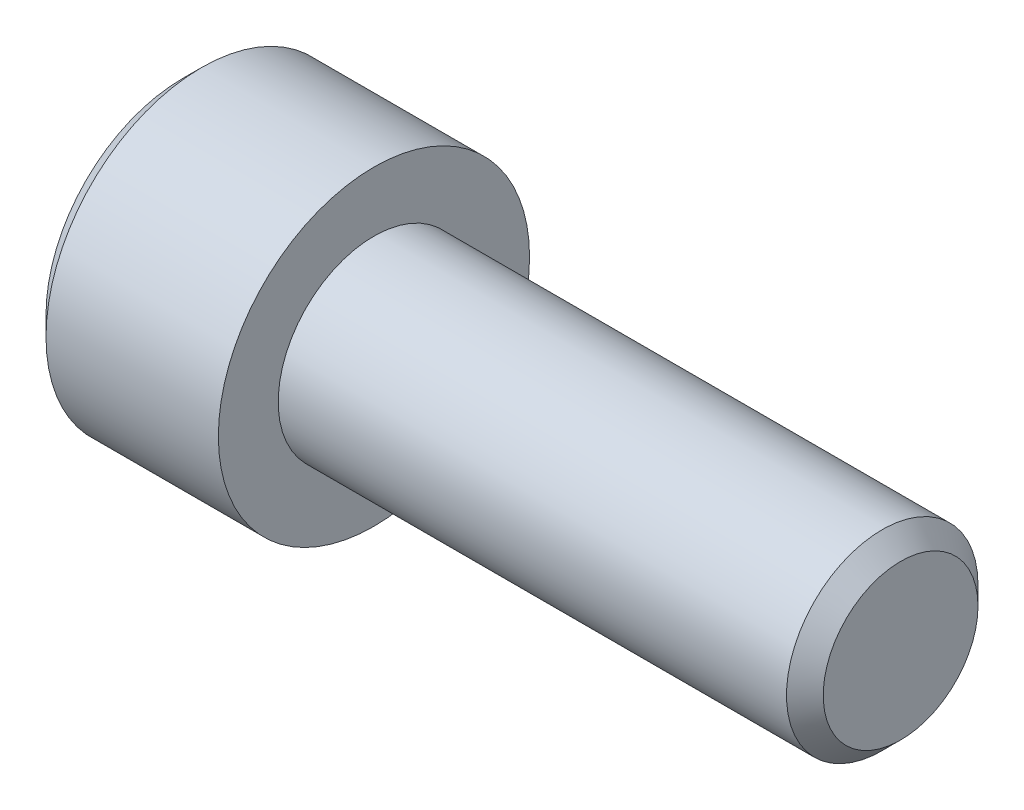
ISO-10303-21;
HEADER;
FILE_DESCRIPTION(('STEP AP214'),'2;1');
FILE_NAME('part.step','',(''),(''),'','','');
FILE_SCHEMA(('AUTOMOTIVE_DESIGN { 1 0 10303 214 1 1 1 1 }'));
ENDSEC;
DATA;
#1=APPLICATION_CONTEXT('core data for automotive mechanical design processes');
#2=APPLICATION_PROTOCOL_DEFINITION('international standard','automotive_design',2000,#1);
#3=PRODUCT_CONTEXT('',#1,'mechanical');
#4=PRODUCT('Part','Part','',(#3));
#5=PRODUCT_RELATED_PRODUCT_CATEGORY('part','',(#4));
#6=PRODUCT_DEFINITION_FORMATION('','',#4);
#7=PRODUCT_DEFINITION_CONTEXT('part definition',#1,'design');
#8=PRODUCT_DEFINITION('design','',#6,#7);
#9=PRODUCT_DEFINITION_SHAPE('','',#8);
#10=(LENGTH_UNIT() NAMED_UNIT(*) SI_UNIT(.MILLI.,.METRE.));
#11=(NAMED_UNIT(*) PLANE_ANGLE_UNIT() SI_UNIT($,.RADIAN.));
#12=(NAMED_UNIT(*) SI_UNIT($,.STERADIAN.) SOLID_ANGLE_UNIT());
#13=UNCERTAINTY_MEASURE_WITH_UNIT(LENGTH_MEASURE(1.E-05),#10,'distance_accuracy_value','');
#14=(GEOMETRIC_REPRESENTATION_CONTEXT(3) GLOBAL_UNCERTAINTY_ASSIGNED_CONTEXT((#13)) GLOBAL_UNIT_ASSIGNED_CONTEXT((#10,
#11,#12)) REPRESENTATION_CONTEXT('',''));
#15=CARTESIAN_POINT('',(0.,0.,0.));
#16=DIRECTION('',(0.,0.,1.));
#17=DIRECTION('',(1.,0.,0.));
#18=AXIS2_PLACEMENT_3D('',#15,#16,#17);
#19=CARTESIAN_POINT('',(-8.,0.,0.));
#20=DIRECTION('',(1.,0.,0.));
#21=DIRECTION('',(0.,0.,-1.));
#22=AXIS2_PLACEMENT_3D('',#19,#20,#21);
#23=PLANE('',#22);
#24=CARTESIAN_POINT('',(-8.,0.,0.));
#25=DIRECTION('',(1.,0.,0.));
#26=DIRECTION('',(0.,0.,-1.));
#27=AXIS2_PLACEMENT_3D('',#24,#25,#26);
#28=CIRCLE('',#27,5.7);
#29=CARTESIAN_POINT('',(-8.,0.,-5.7));
#30=VERTEX_POINT('',#29);
#31=EDGE_CURVE('E115',#30,#30,#28,.T.);
#32=ORIENTED_EDGE('',*,*,#31,.F.);
#33=EDGE_LOOP('',(#32));
#34=FACE_BOUND('',#33,.T.);
#35=DIRECTION('',(0.,0.500000000000001,-0.866025403784438));
#36=VECTOR('',#35,1.);
#37=CARTESIAN_POINT('',(-8.,-3.4641016151378,0.));
#38=LINE('',#37,#36);
#39=CARTESIAN_POINT('',(-8.,-3.4641016151378,0.));
#40=VERTEX_POINT('',#39);
#41=CARTESIAN_POINT('',(-8.,-1.7320508075689,-3.));
#42=VERTEX_POINT('',#41);
#43=EDGE_CURVE('E100',#40,#42,#38,.T.);
#44=ORIENTED_EDGE('',*,*,#43,.T.);
#45=DIRECTION('',(0.,1.,0.));
#46=VECTOR('',#45,1.);
#47=CARTESIAN_POINT('',(-8.,-1.7320508075689,-3.));
#48=LINE('',#47,#46);
#49=CARTESIAN_POINT('',(-8.,1.7320508075689,-3.));
#50=VERTEX_POINT('',#49);
#51=EDGE_CURVE('E88',#42,#50,#48,.T.);
#52=ORIENTED_EDGE('',*,*,#51,.T.);
#53=DIRECTION('',(0.,0.500000000000001,0.866025403784438));
#54=VECTOR('',#53,1.);
#55=CARTESIAN_POINT('',(-8.,1.7320508075689,-3.));
#56=LINE('',#55,#54);
#57=CARTESIAN_POINT('',(-8.,3.4641016151378,0.));
#58=VERTEX_POINT('',#57);
#59=EDGE_CURVE('E99',#50,#58,#56,.T.);
#60=ORIENTED_EDGE('',*,*,#59,.T.);
#61=DIRECTION('',(0.,-0.500000000000001,0.866025403784438));
#62=VECTOR('',#61,1.);
#63=CARTESIAN_POINT('',(-8.,3.4641016151378,0.));
#64=LINE('',#63,#62);
#65=CARTESIAN_POINT('',(-8.,1.7320508075689,3.));
#66=VERTEX_POINT('',#65);
#67=EDGE_CURVE('E125',#58,#66,#64,.T.);
#68=ORIENTED_EDGE('',*,*,#67,.T.);
#69=DIRECTION('',(0.,-1.,0.));
#70=VECTOR('',#69,1.);
#71=CARTESIAN_POINT('',(-8.,1.7320508075689,3.));
#72=LINE('',#71,#70);
#73=CARTESIAN_POINT('',(-8.,-1.7320508075689,3.));
#74=VERTEX_POINT('',#73);
#75=EDGE_CURVE('E130',#66,#74,#72,.T.);
#76=ORIENTED_EDGE('',*,*,#75,.T.);
#77=DIRECTION('',(0.,-0.500000000000001,-0.866025403784438));
#78=VECTOR('',#77,1.);
#79=CARTESIAN_POINT('',(-8.,-1.7320508075689,3.));
#80=LINE('',#79,#78);
#81=EDGE_CURVE('E114',#74,#40,#80,.T.);
#82=ORIENTED_EDGE('',*,*,#81,.T.);
#83=EDGE_LOOP('',(#44,#52,#60,#68,#76,#82));
#84=FACE_BOUND('',#83,.T.);
#85=ADVANCED_FACE('F16',(#34,#84),#23,.F.);
#86=CARTESIAN_POINT('',(-8.,0.,0.));
#87=DIRECTION('',(1.,0.,0.));
#88=DIRECTION('',(0.,0.,-1.));
#89=AXIS2_PLACEMENT_3D('',#86,#87,#88);
#90=CONICAL_SURFACE('',#89,5.7,0.785398163397449);
#91=CARTESIAN_POINT('',(-7.2,0.,0.));
#92=DIRECTION('',(1.,0.,0.));
#93=DIRECTION('',(0.,0.,-1.));
#94=AXIS2_PLACEMENT_3D('',#91,#92,#93);
#95=CIRCLE('',#94,6.5);
#96=CARTESIAN_POINT('',(-7.2,0.,-6.5));
#97=VERTEX_POINT('',#96);
#98=EDGE_CURVE('E137',#97,#97,#95,.T.);
#99=ORIENTED_EDGE('',*,*,#98,.F.);
#100=EDGE_LOOP('',(#99));
#101=FACE_BOUND('',#100,.T.);
#102=ORIENTED_EDGE('',*,*,#31,.T.);
#103=EDGE_LOOP('',(#102));
#104=FACE_BOUND('',#103,.T.);
#105=ADVANCED_FACE('F279',(#101,#104),#90,.T.);
#106=CARTESIAN_POINT('',(-4.,-3.4641016151378,0.));
#107=DIRECTION('',(0.,0.866025403784438,0.500000000000001));
#108=DIRECTION('',(0.,-0.500000000000001,0.866025403784438));
#109=AXIS2_PLACEMENT_3D('',#106,#107,#108);
#110=PLANE('',#109);
#111=ORIENTED_EDGE('',*,*,#43,.F.);
#112=DIRECTION('',(-1.,0.,0.));
#113=VECTOR('',#112,1.);
#114=CARTESIAN_POINT('',(-4.,-3.4641016151378,0.));
#115=LINE('',#114,#113);
#116=CARTESIAN_POINT('',(-4.,-3.4641016151378,0.));
#117=VERTEX_POINT('',#116);
#118=EDGE_CURVE('E142',#117,#40,#115,.T.);
#119=ORIENTED_EDGE('',*,*,#118,.F.);
#120=DIRECTION('',(0.,0.500000000000001,-0.866025403784438));
#121=VECTOR('',#120,1.);
#122=CARTESIAN_POINT('',(-4.,-3.4641016151378,0.));
#123=LINE('',#122,#121);
#124=CARTESIAN_POINT('',(-4.,-2.5980762113533,-1.5));
#125=VERTEX_POINT('',#124);
#126=EDGE_CURVE('E144',#117,#125,#123,.T.);
#127=ORIENTED_EDGE('',*,*,#126,.T.);
#128=DIRECTION('',(0.,0.500000000000001,-0.866025403784438));
#129=VECTOR('',#128,1.);
#130=CARTESIAN_POINT('',(-4.,-2.59807621135334,-1.50000000000002));
#131=LINE('',#130,#129);
#132=CARTESIAN_POINT('',(-4.,-1.7320508075689,-3.));
#133=VERTEX_POINT('',#132);
#134=EDGE_CURVE('E109',#125,#133,#131,.T.);
#135=ORIENTED_EDGE('',*,*,#134,.T.);
#136=DIRECTION('',(-1.,0.,0.));
#137=VECTOR('',#136,1.);
#138=CARTESIAN_POINT('',(-4.,-1.7320508075689,-3.));
#139=LINE('',#138,#137);
#140=EDGE_CURVE('E92',#133,#42,#139,.T.);
#141=ORIENTED_EDGE('',*,*,#140,.T.);
#142=EDGE_LOOP('',(#111,#119,#127,#135,#141));
#143=FACE_BOUND('',#142,.T.);
#144=ADVANCED_FACE('F105',(#143),#110,.T.);
#145=CARTESIAN_POINT('',(-4.,-1.7320508075689,-3.));
#146=DIRECTION('',(0.,0.,1.));
#147=DIRECTION('',(1.,0.,0.));
#148=AXIS2_PLACEMENT_3D('',#145,#146,#147);
#149=PLANE('',#148);
#150=ORIENTED_EDGE('',*,*,#51,.F.);
#151=ORIENTED_EDGE('',*,*,#140,.F.);
#152=DIRECTION('',(0.,1.,0.));
#153=VECTOR('',#152,1.);
#154=CARTESIAN_POINT('',(-4.,-1.7320508075689,-3.));
#155=LINE('',#154,#153);
#156=CARTESIAN_POINT('',(-4.,0.,-3.));
#157=VERTEX_POINT('',#156);
#158=EDGE_CURVE('E110',#133,#157,#155,.T.);
#159=ORIENTED_EDGE('',*,*,#158,.T.);
#160=DIRECTION('',(0.,1.,0.));
#161=VECTOR('',#160,1.);
#162=CARTESIAN_POINT('',(-4.,0.,-3.));
#163=LINE('',#162,#161);
#164=CARTESIAN_POINT('',(-4.,1.7320508075689,-3.));
#165=VERTEX_POINT('',#164);
#166=EDGE_CURVE('E156',#157,#165,#163,.T.);
#167=ORIENTED_EDGE('',*,*,#166,.T.);
#168=DIRECTION('',(-1.,0.,0.));
#169=VECTOR('',#168,1.);
#170=CARTESIAN_POINT('',(-4.,1.7320508075689,-3.));
#171=LINE('',#170,#169);
#172=EDGE_CURVE('E95',#165,#50,#171,.T.);
#173=ORIENTED_EDGE('',*,*,#172,.T.);
#174=EDGE_LOOP('',(#150,#151,#159,#167,#173));
#175=FACE_BOUND('',#174,.T.);
#176=ADVANCED_FACE('F90',(#175),#149,.T.);
#177=CARTESIAN_POINT('',(-4.,1.7320508075689,-3.));
#178=DIRECTION('',(0.,-0.866025403784438,0.500000000000001));
#179=DIRECTION('',(0.,-0.500000000000001,-0.866025403784438));
#180=AXIS2_PLACEMENT_3D('',#177,#178,#179);
#181=PLANE('',#180);
#182=ORIENTED_EDGE('',*,*,#59,.F.);
#183=ORIENTED_EDGE('',*,*,#172,.F.);
#184=DIRECTION('',(0.,0.500000000000001,0.866025403784438));
#185=VECTOR('',#184,1.);
#186=CARTESIAN_POINT('',(-4.,1.7320508075689,-3.));
#187=LINE('',#186,#185);
#188=CARTESIAN_POINT('',(-4.,2.59807621135334,-1.50000000000003));
#189=VERTEX_POINT('',#188);
#190=EDGE_CURVE('E163',#165,#189,#187,.T.);
#191=ORIENTED_EDGE('',*,*,#190,.T.);
#192=DIRECTION('',(0.,0.500000000000001,0.866025403784438));
#193=VECTOR('',#192,1.);
#194=CARTESIAN_POINT('',(-4.,2.59807621135333,-1.50000000000002));
#195=LINE('',#194,#193);
#196=CARTESIAN_POINT('',(-4.,3.4641016151378,0.));
#197=VERTEX_POINT('',#196);
#198=EDGE_CURVE('E168',#189,#197,#195,.T.);
#199=ORIENTED_EDGE('',*,*,#198,.T.);
#200=DIRECTION('',(-1.,0.,0.));
#201=VECTOR('',#200,1.);
#202=CARTESIAN_POINT('',(-4.,3.4641016151378,0.));
#203=LINE('',#202,#201);
#204=EDGE_CURVE('E173',#197,#58,#203,.T.);
#205=ORIENTED_EDGE('',*,*,#204,.T.);
#206=EDGE_LOOP('',(#182,#183,#191,#199,#205));
#207=FACE_BOUND('',#206,.T.);
#208=ADVANCED_FACE('F295',(#207),#181,.T.);
#209=CARTESIAN_POINT('',(-4.,3.4641016151378,0.));
#210=DIRECTION('',(0.,-0.866025403784438,-0.500000000000001));
#211=DIRECTION('',(0.,0.500000000000001,-0.866025403784438));
#212=AXIS2_PLACEMENT_3D('',#209,#210,#211);
#213=PLANE('',#212);
#214=ORIENTED_EDGE('',*,*,#67,.F.);
#215=ORIENTED_EDGE('',*,*,#204,.F.);
#216=DIRECTION('',(0.,-0.500000000000001,0.866025403784438));
#217=VECTOR('',#216,1.);
#218=CARTESIAN_POINT('',(-4.,3.4641016151378,0.));
#219=LINE('',#218,#217);
#220=CARTESIAN_POINT('',(-4.,2.59807621135334,1.50000000000003));
#221=VERTEX_POINT('',#220);
#222=EDGE_CURVE('E178',#197,#221,#219,.T.);
#223=ORIENTED_EDGE('',*,*,#222,.T.);
#224=DIRECTION('',(0.,-0.500000000000001,0.866025403784438));
#225=VECTOR('',#224,1.);
#226=CARTESIAN_POINT('',(-4.,2.59807621135334,1.50000000000003));
#227=LINE('',#226,#225);
#228=CARTESIAN_POINT('',(-4.,1.7320508075689,3.));
#229=VERTEX_POINT('',#228);
#230=EDGE_CURVE('E183',#221,#229,#227,.T.);
#231=ORIENTED_EDGE('',*,*,#230,.T.);
#232=DIRECTION('',(-1.,0.,0.));
#233=VECTOR('',#232,1.);
#234=CARTESIAN_POINT('',(-4.,1.7320508075689,3.));
#235=LINE('',#234,#233);
#236=EDGE_CURVE('E188',#229,#66,#235,.T.);
#237=ORIENTED_EDGE('',*,*,#236,.T.);
#238=EDGE_LOOP('',(#214,#215,#223,#231,#237));
#239=FACE_BOUND('',#238,.T.);
#240=ADVANCED_FACE('F298',(#239),#213,.T.);
#241=CARTESIAN_POINT('',(-4.,1.7320508075689,3.));
#242=DIRECTION('',(0.,0.,-1.));
#243=DIRECTION('',(-1.,0.,0.));
#244=AXIS2_PLACEMENT_3D('',#241,#242,#243);
#245=PLANE('',#244);
#246=ORIENTED_EDGE('',*,*,#75,.F.);
#247=ORIENTED_EDGE('',*,*,#236,.F.);
#248=DIRECTION('',(0.,-1.,0.));
#249=VECTOR('',#248,1.);
#250=CARTESIAN_POINT('',(-4.,1.7320508075689,3.));
#251=LINE('',#250,#249);
#252=CARTESIAN_POINT('',(-4.,0.,3.));
#253=VERTEX_POINT('',#252);
#254=EDGE_CURVE('E193',#229,#253,#251,.T.);
#255=ORIENTED_EDGE('',*,*,#254,.T.);
#256=DIRECTION('',(0.,-1.,0.));
#257=VECTOR('',#256,1.);
#258=CARTESIAN_POINT('',(-4.,0.,3.));
#259=LINE('',#258,#257);
#260=CARTESIAN_POINT('',(-4.,-1.7320508075689,3.));
#261=VERTEX_POINT('',#260);
#262=EDGE_CURVE('E198',#253,#261,#259,.T.);
#263=ORIENTED_EDGE('',*,*,#262,.T.);
#264=DIRECTION('',(-1.,0.,0.));
#265=VECTOR('',#264,1.);
#266=CARTESIAN_POINT('',(-4.,-1.7320508075689,3.));
#267=LINE('',#266,#265);
#268=EDGE_CURVE('E203',#261,#74,#267,.T.);
#269=ORIENTED_EDGE('',*,*,#268,.T.);
#270=EDGE_LOOP('',(#246,#247,#255,#263,#269));
#271=FACE_BOUND('',#270,.T.);
#272=ADVANCED_FACE('F302',(#271),#245,.T.);
#273=CARTESIAN_POINT('',(-4.,-1.7320508075689,3.));
#274=DIRECTION('',(0.,0.866025403784438,-0.500000000000001));
#275=DIRECTION('',(0.,0.500000000000001,0.866025403784438));
#276=AXIS2_PLACEMENT_3D('',#273,#274,#275);
#277=PLANE('',#276);
#278=ORIENTED_EDGE('',*,*,#81,.F.);
#279=ORIENTED_EDGE('',*,*,#268,.F.);
#280=DIRECTION('',(0.,-0.500000000000001,-0.866025403784438));
#281=VECTOR('',#280,1.);
#282=CARTESIAN_POINT('',(-4.,-1.7320508075689,3.));
#283=LINE('',#282,#281);
#284=CARTESIAN_POINT('',(-4.,-2.59807621135334,1.50000000000003));
#285=VERTEX_POINT('',#284);
#286=EDGE_CURVE('E208',#261,#285,#283,.T.);
#287=ORIENTED_EDGE('',*,*,#286,.T.);
#288=DIRECTION('',(0.,-0.500000000000001,-0.866025403784438));
#289=VECTOR('',#288,1.);
#290=CARTESIAN_POINT('',(-4.,-2.59807621135333,1.50000000000002));
#291=LINE('',#290,#289);
#292=EDGE_CURVE('E213',#285,#117,#291,.T.);
#293=ORIENTED_EDGE('',*,*,#292,.T.);
#294=ORIENTED_EDGE('',*,*,#118,.T.);
#295=EDGE_LOOP('',(#278,#279,#287,#293,#294));
#296=FACE_BOUND('',#295,.T.);
#297=ADVANCED_FACE('F275',(#296),#277,.T.);
#298=CARTESIAN_POINT('',(22.,0.,0.));
#299=DIRECTION('',(1.,0.,0.));
#300=DIRECTION('',(0.,0.,-1.));
#301=AXIS2_PLACEMENT_3D('',#298,#299,#300);
#302=CYLINDRICAL_SURFACE('',#301,6.5);
#303=CARTESIAN_POINT('',(0.,0.,0.));
#304=DIRECTION('',(1.,0.,0.));
#305=DIRECTION('',(0.,0.,-1.));
#306=AXIS2_PLACEMENT_3D('',#303,#304,#305);
#307=CIRCLE('',#306,6.5);
#308=CARTESIAN_POINT('',(0.,0.,-6.5));
#309=VERTEX_POINT('',#308);
#310=EDGE_CURVE('E218',#309,#309,#307,.T.);
#311=ORIENTED_EDGE('',*,*,#310,.F.);
#312=EDGE_LOOP('',(#311));
#313=FACE_BOUND('',#312,.T.);
#314=ORIENTED_EDGE('',*,*,#98,.T.);
#315=EDGE_LOOP('',(#314));
#316=FACE_BOUND('',#315,.T.);
#317=ADVANCED_FACE('F271',(#313,#316),#302,.T.);
#318=CARTESIAN_POINT('',(-4.,0.,0.));
#319=DIRECTION('',(1.,0.,0.));
#320=DIRECTION('',(0.,0.,-1.));
#321=AXIS2_PLACEMENT_3D('',#318,#319,#320);
#322=PLANE('',#321);
#323=CARTESIAN_POINT('',(-4.,0.,0.));
#324=DIRECTION('',(1.,0.,0.));
#325=DIRECTION('',(0.,-0.866025403784436,0.500000000000005));
#326=AXIS2_PLACEMENT_3D('',#323,#324,#325);
#327=CIRCLE('',#326,3.);
#328=EDGE_CURVE('E34',#285,#125,#327,.T.);
#329=ORIENTED_EDGE('',*,*,#328,.T.);
#330=ORIENTED_EDGE('',*,*,#126,.F.);
#331=ORIENTED_EDGE('',*,*,#292,.F.);
#332=EDGE_LOOP('',(#329,#330,#331));
#333=FACE_BOUND('',#332,.T.);
#334=ADVANCED_FACE('F274',(#333),#322,.F.);
#335=CARTESIAN_POINT('',(-4.,0.,0.));
#336=DIRECTION('',(1.,0.,0.));
#337=DIRECTION('',(0.,-0.866025403784438,-0.500000000000002));
#338=AXIS2_PLACEMENT_3D('',#335,#336,#337);
#339=CIRCLE('',#338,3.);
#340=EDGE_CURVE('E224',#125,#157,#339,.T.);
#341=ORIENTED_EDGE('',*,*,#340,.T.);
#342=ORIENTED_EDGE('',*,*,#158,.F.);
#343=ORIENTED_EDGE('',*,*,#134,.F.);
#344=EDGE_LOOP('',(#341,#342,#343));
#345=FACE_BOUND('',#344,.T.);
#346=ADVANCED_FACE('F311',(#345),#322,.F.);
#347=CARTESIAN_POINT('',(-4.,0.,0.));
#348=DIRECTION('',(1.,0.,0.));
#349=DIRECTION('',(0.,0.,-1.));
#350=AXIS2_PLACEMENT_3D('',#347,#348,#349);
#351=CIRCLE('',#350,3.);
#352=EDGE_CURVE('E229',#157,#189,#351,.T.);
#353=ORIENTED_EDGE('',*,*,#352,.T.);
#354=ORIENTED_EDGE('',*,*,#190,.F.);
#355=ORIENTED_EDGE('',*,*,#166,.F.);
#356=EDGE_LOOP('',(#353,#354,#355));
#357=FACE_BOUND('',#356,.T.);
#358=ADVANCED_FACE('F379',(#357),#322,.F.);
#359=CARTESIAN_POINT('',(-4.,0.,0.));
#360=DIRECTION('',(1.,0.,0.));
#361=DIRECTION('',(0.,0.866025403784436,-0.500000000000005));
#362=AXIS2_PLACEMENT_3D('',#359,#360,#361);
#363=CIRCLE('',#362,3.);
#364=EDGE_CURVE('E234',#189,#221,#363,.T.);
#365=ORIENTED_EDGE('',*,*,#364,.T.);
#366=ORIENTED_EDGE('',*,*,#222,.F.);
#367=ORIENTED_EDGE('',*,*,#198,.F.);
#368=EDGE_LOOP('',(#365,#366,#367));
#369=FACE_BOUND('',#368,.T.);
#370=ADVANCED_FACE('F370',(#369),#322,.F.);
#371=CARTESIAN_POINT('',(-4.,0.,0.));
#372=DIRECTION('',(1.,0.,0.));
#373=DIRECTION('',(0.,0.866025403784436,0.500000000000005));
#374=AXIS2_PLACEMENT_3D('',#371,#372,#373);
#375=CIRCLE('',#374,3.);
#376=EDGE_CURVE('E239',#221,#253,#375,.T.);
#377=ORIENTED_EDGE('',*,*,#376,.T.);
#378=ORIENTED_EDGE('',*,*,#254,.F.);
#379=ORIENTED_EDGE('',*,*,#230,.F.);
#380=EDGE_LOOP('',(#377,#378,#379));
#381=FACE_BOUND('',#380,.T.);
#382=ADVANCED_FACE('F361',(#381),#322,.F.);
#383=CARTESIAN_POINT('',(-4.,0.,0.));
#384=DIRECTION('',(1.,0.,0.));
#385=DIRECTION('',(0.,0.,1.));
#386=AXIS2_PLACEMENT_3D('',#383,#384,#385);
#387=CIRCLE('',#386,3.);
#388=EDGE_CURVE('E244',#253,#285,#387,.T.);
#389=ORIENTED_EDGE('',*,*,#388,.T.);
#390=ORIENTED_EDGE('',*,*,#286,.F.);
#391=ORIENTED_EDGE('',*,*,#262,.F.);
#392=EDGE_LOOP('',(#389,#390,#391));
#393=FACE_BOUND('',#392,.T.);
#394=ADVANCED_FACE('F267',(#393),#322,.F.);
#395=CARTESIAN_POINT('',(0.,6.5,0.));
#396=DIRECTION('',(-1.,0.,0.));
#397=DIRECTION('',(0.,0.,1.));
#398=AXIS2_PLACEMENT_3D('',#395,#396,#397);
#399=PLANE('',#398);
#400=CARTESIAN_POINT('',(0.,0.,0.));
#401=DIRECTION('',(1.,0.,0.));
#402=DIRECTION('',(0.,0.,-1.));
#403=AXIS2_PLACEMENT_3D('',#400,#401,#402);
#404=CIRCLE('',#403,4.);
#405=CARTESIAN_POINT('',(0.,0.,-4.));
#406=VERTEX_POINT('',#405);
#407=EDGE_CURVE('E248',#406,#406,#404,.T.);
#408=ORIENTED_EDGE('',*,*,#407,.F.);
#409=EDGE_LOOP('',(#408));
#410=FACE_BOUND('',#409,.T.);
#411=ORIENTED_EDGE('',*,*,#310,.T.);
#412=EDGE_LOOP('',(#411));
#413=FACE_BOUND('',#412,.T.);
#414=ADVANCED_FACE('F264',(#410,#413),#399,.F.);
#415=CARTESIAN_POINT('',(-4.,0.,0.));
#416=DIRECTION('',(-1.,0.,0.));
#417=DIRECTION('',(0.,0.,1.));
#418=AXIS2_PLACEMENT_3D('',#415,#416,#417);
#419=CONICAL_SURFACE('',#418,3.,1.30899693899574);
#420=CARTESIAN_POINT('',(-3.1961524227066,0.,0.));
#421=VERTEX_POINT('',#420);
#422=VERTEX_LOOP('',#421);
#423=FACE_BOUND('',#422,.T.);
#424=ORIENTED_EDGE('',*,*,#352,.F.);
#425=ORIENTED_EDGE('',*,*,#340,.F.);
#426=ORIENTED_EDGE('',*,*,#328,.F.);
#427=ORIENTED_EDGE('',*,*,#388,.F.);
#428=ORIENTED_EDGE('',*,*,#376,.F.);
#429=ORIENTED_EDGE('',*,*,#364,.F.);
#430=EDGE_LOOP('',(#424,#425,#426,#427,#428,#429));
#431=FACE_BOUND('',#430,.T.);
#432=ADVANCED_FACE('F260',(#423,#431),#419,.F.);
#433=CARTESIAN_POINT('',(22.,0.,0.));
#434=DIRECTION('',(1.,0.,0.));
#435=DIRECTION('',(0.,0.,-1.));
#436=AXIS2_PLACEMENT_3D('',#433,#434,#435);
#437=CYLINDRICAL_SURFACE('',#436,4.);
#438=CARTESIAN_POINT('',(21.233,0.,0.));
#439=DIRECTION('',(1.,0.,0.));
#440=DIRECTION('',(0.,0.,-1.));
#441=AXIS2_PLACEMENT_3D('',#438,#439,#440);
#442=CIRCLE('',#441,4.);
#443=CARTESIAN_POINT('',(21.233,0.,-4.));
#444=VERTEX_POINT('',#443);
#445=EDGE_CURVE('E24',#444,#444,#442,.T.);
#446=ORIENTED_EDGE('',*,*,#445,.F.);
#447=EDGE_LOOP('',(#446));
#448=FACE_BOUND('',#447,.T.);
#449=ORIENTED_EDGE('',*,*,#407,.T.);
#450=EDGE_LOOP('',(#449));
#451=FACE_BOUND('',#450,.T.);
#452=ADVANCED_FACE('F257',(#448,#451),#437,.T.);
#453=CARTESIAN_POINT('',(21.233,0.,0.));
#454=DIRECTION('',(-1.,0.,0.));
#455=DIRECTION('',(0.,0.,1.));
#456=AXIS2_PLACEMENT_3D('',#453,#454,#455);
#457=CONICAL_SURFACE('',#456,4.,0.78539816339745);
#458=CARTESIAN_POINT('',(22.,0.,0.));
#459=DIRECTION('',(1.,0.,0.));
#460=DIRECTION('',(0.,0.,-1.));
#461=AXIS2_PLACEMENT_3D('',#458,#459,#460);
#462=CIRCLE('',#461,3.23299999999999);
#463=CARTESIAN_POINT('',(22.,0.,-3.23299999999999));
#464=VERTEX_POINT('',#463);
#465=EDGE_CURVE('E11',#464,#464,#462,.T.);
#466=ORIENTED_EDGE('',*,*,#465,.F.);
#467=EDGE_LOOP('',(#466));
#468=FACE_BOUND('',#467,.T.);
#469=ORIENTED_EDGE('',*,*,#445,.T.);
#470=EDGE_LOOP('',(#469));
#471=FACE_BOUND('',#470,.T.);
#472=ADVANCED_FACE('F255',(#468,#471),#457,.T.);
#473=CARTESIAN_POINT('',(22.,3.233,0.));
#474=DIRECTION('',(-1.,0.,0.));
#475=DIRECTION('',(0.,0.,1.));
#476=AXIS2_PLACEMENT_3D('',#473,#474,#475);
#477=PLANE('',#476);
#478=ORIENTED_EDGE('',*,*,#465,.T.);
#479=EDGE_LOOP('',(#478));
#480=FACE_BOUND('',#479,.T.);
#481=ADVANCED_FACE('F18',(#480),#477,.F.);
#482=CLOSED_SHELL('',(#85,#105,#144,#176,#208,#240,#272,#297,#317,#334,#346,#358,#370,#382,#394,
#414,#432,#452,#472,#481));
#483=MANIFOLD_SOLID_BREP('B1',#482);
#484=ADVANCED_BREP_SHAPE_REPRESENTATION('',(#18,#483),#14);
#485=SHAPE_DEFINITION_REPRESENTATION(#9,#484);
ENDSEC;
END-ISO-10303-21;
